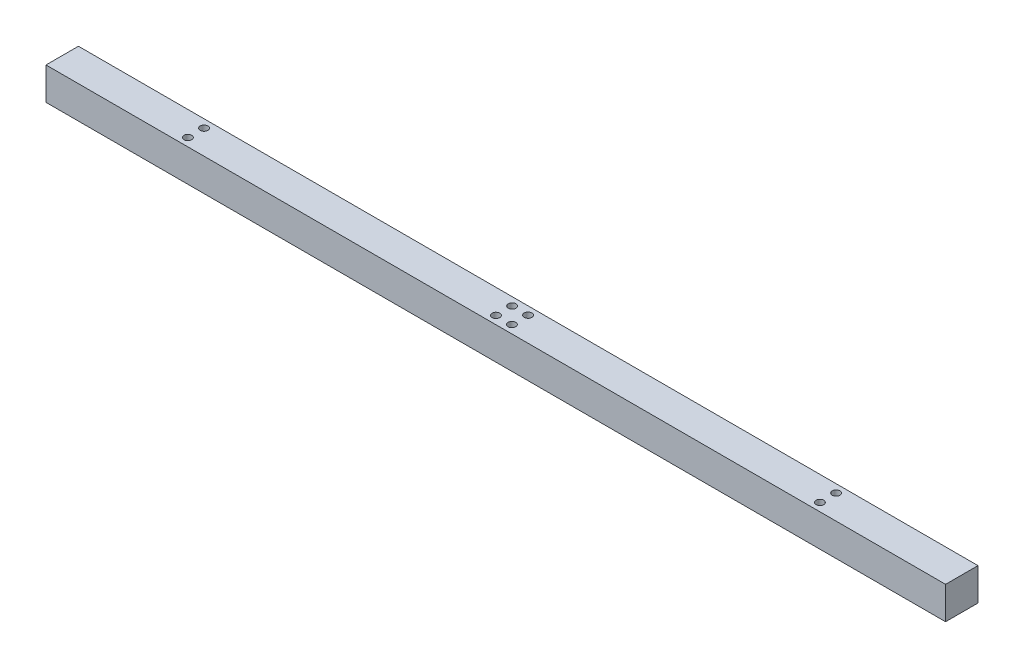
ISO-10303-21;
HEADER;
FILE_DESCRIPTION(('STEP AP214'),'2;1');
FILE_NAME('part.step','',(''),(''),'','','');
FILE_SCHEMA(('AUTOMOTIVE_DESIGN { 1 0 10303 214 1 1 1 1 }'));
ENDSEC;
DATA;
#1=APPLICATION_CONTEXT('core data for automotive mechanical design processes');
#2=APPLICATION_PROTOCOL_DEFINITION('international standard','automotive_design',2000,#1);
#3=PRODUCT_CONTEXT('',#1,'mechanical');
#4=PRODUCT('Part','Part','',(#3));
#5=PRODUCT_RELATED_PRODUCT_CATEGORY('part','',(#4));
#6=PRODUCT_DEFINITION_FORMATION('','',#4);
#7=PRODUCT_DEFINITION_CONTEXT('part definition',#1,'design');
#8=PRODUCT_DEFINITION('design','',#6,#7);
#9=PRODUCT_DEFINITION_SHAPE('','',#8);
#10=(LENGTH_UNIT() NAMED_UNIT(*) SI_UNIT(.MILLI.,.METRE.));
#11=(NAMED_UNIT(*) PLANE_ANGLE_UNIT() SI_UNIT($,.RADIAN.));
#12=(NAMED_UNIT(*) SI_UNIT($,.STERADIAN.) SOLID_ANGLE_UNIT());
#13=UNCERTAINTY_MEASURE_WITH_UNIT(LENGTH_MEASURE(1.E-05),#10,'distance_accuracy_value','');
#14=(GEOMETRIC_REPRESENTATION_CONTEXT(3) GLOBAL_UNCERTAINTY_ASSIGNED_CONTEXT((#13)) GLOBAL_UNIT_ASSIGNED_CONTEXT((#10,
#11,#12)) REPRESENTATION_CONTEXT('',''));
#15=CARTESIAN_POINT('',(0.,0.,0.));
#16=DIRECTION('',(0.,0.,1.));
#17=DIRECTION('',(1.,0.,0.));
#18=AXIS2_PLACEMENT_3D('',#15,#16,#17);
#19=CARTESIAN_POINT('',(277.4,-5.,-5.));
#20=DIRECTION('',(0.,0.,1.));
#21=DIRECTION('',(1.,0.,0.));
#22=AXIS2_PLACEMENT_3D('',#19,#20,#21);
#23=PLANE('',#22);
#24=DIRECTION('',(0.,1.,0.));
#25=VECTOR('',#24,1.);
#26=CARTESIAN_POINT('',(0.,-5.,-5.));
#27=LINE('',#26,#25);
#28=CARTESIAN_POINT('',(0.,-5.,-5.));
#29=VERTEX_POINT('',#28);
#30=CARTESIAN_POINT('',(0.,5.,-5.));
#31=VERTEX_POINT('',#30);
#32=EDGE_CURVE('E179',#29,#31,#27,.T.);
#33=ORIENTED_EDGE('',*,*,#32,.T.);
#34=DIRECTION('',(-1.,0.,0.));
#35=VECTOR('',#34,1.);
#36=CARTESIAN_POINT('',(277.4,5.,-5.));
#37=LINE('',#36,#35);
#38=CARTESIAN_POINT('',(277.4,5.,-5.));
#39=VERTEX_POINT('',#38);
#40=EDGE_CURVE('E11',#39,#31,#37,.T.);
#41=ORIENTED_EDGE('',*,*,#40,.F.);
#42=DIRECTION('',(0.,1.,0.));
#43=VECTOR('',#42,1.);
#44=CARTESIAN_POINT('',(277.4,-5.,-5.));
#45=LINE('',#44,#43);
#46=CARTESIAN_POINT('',(277.4,-5.,-5.));
#47=VERTEX_POINT('',#46);
#48=EDGE_CURVE('E180',#47,#39,#45,.T.);
#49=ORIENTED_EDGE('',*,*,#48,.F.);
#50=DIRECTION('',(-1.,0.,0.));
#51=VECTOR('',#50,1.);
#52=CARTESIAN_POINT('',(277.4,-5.,-5.));
#53=LINE('',#52,#51);
#54=EDGE_CURVE('E186',#47,#29,#53,.T.);
#55=ORIENTED_EDGE('',*,*,#54,.T.);
#56=EDGE_LOOP('',(#33,#41,#49,#55));
#57=FACE_BOUND('',#56,.T.);
#58=ADVANCED_FACE('F32',(#57),#23,.F.);
#59=CARTESIAN_POINT('',(277.4,5.,5.));
#60=DIRECTION('',(0.,-1.,0.));
#61=DIRECTION('',(0.,0.,-1.));
#62=AXIS2_PLACEMENT_3D('',#59,#60,#61);
#63=PLANE('',#62);
#64=CARTESIAN_POINT('',(41.25,5.,-2.50000000000001));
#65=DIRECTION('',(0.,1.,0.));
#66=DIRECTION('',(0.,0.,1.));
#67=AXIS2_PLACEMENT_3D('',#64,#65,#66);
#68=CIRCLE('',#67,1.19062499999999);
#69=CARTESIAN_POINT('',(41.25,5.,-1.30937500000002));
#70=VERTEX_POINT('',#69);
#71=EDGE_CURVE('E121',#70,#70,#68,.T.);
#72=ORIENTED_EDGE('',*,*,#71,.F.);
#73=EDGE_LOOP('',(#72));
#74=FACE_BOUND('',#73,.T.);
#75=CARTESIAN_POINT('',(41.25,5.,2.50000000000005));
#76=DIRECTION('',(0.,1.,0.));
#77=DIRECTION('',(0.,0.,1.));
#78=AXIS2_PLACEMENT_3D('',#75,#76,#77);
#79=CIRCLE('',#78,1.19062499999999);
#80=CARTESIAN_POINT('',(41.25,5.,3.69062500000004));
#81=VERTEX_POINT('',#80);
#82=EDGE_CURVE('E120',#81,#81,#79,.T.);
#83=ORIENTED_EDGE('',*,*,#82,.F.);
#84=EDGE_LOOP('',(#83));
#85=FACE_BOUND('',#84,.T.);
#86=CARTESIAN_POINT('',(136.25,5.,-2.50000000000001));
#87=DIRECTION('',(0.,1.,0.));
#88=DIRECTION('',(0.,0.,1.));
#89=AXIS2_PLACEMENT_3D('',#86,#87,#88);
#90=CIRCLE('',#89,1.190625);
#91=CARTESIAN_POINT('',(136.25,5.,-1.30937500000001));
#92=VERTEX_POINT('',#91);
#93=EDGE_CURVE('E131',#92,#92,#90,.T.);
#94=ORIENTED_EDGE('',*,*,#93,.F.);
#95=EDGE_LOOP('',(#94));
#96=FACE_BOUND('',#95,.T.);
#97=CARTESIAN_POINT('',(136.25,5.,2.50000000000001));
#98=DIRECTION('',(0.,1.,0.));
#99=DIRECTION('',(0.,0.,1.));
#100=AXIS2_PLACEMENT_3D('',#97,#98,#99);
#101=CIRCLE('',#100,1.190625);
#102=CARTESIAN_POINT('',(136.25,5.,3.69062500000001));
#103=VERTEX_POINT('',#102);
#104=EDGE_CURVE('E137',#103,#103,#101,.T.);
#105=ORIENTED_EDGE('',*,*,#104,.F.);
#106=EDGE_LOOP('',(#105));
#107=FACE_BOUND('',#106,.T.);
#108=CARTESIAN_POINT('',(141.15,5.,2.50000000000001));
#109=DIRECTION('',(0.,1.,0.));
#110=DIRECTION('',(0.,0.,1.));
#111=AXIS2_PLACEMENT_3D('',#108,#109,#110);
#112=CIRCLE('',#111,1.190625);
#113=CARTESIAN_POINT('',(141.15,5.,3.69062500000001));
#114=VERTEX_POINT('',#113);
#115=EDGE_CURVE('E143',#114,#114,#112,.T.);
#116=ORIENTED_EDGE('',*,*,#115,.F.);
#117=EDGE_LOOP('',(#116));
#118=FACE_BOUND('',#117,.T.);
#119=CARTESIAN_POINT('',(141.15,5.,-2.50000000000001));
#120=DIRECTION('',(0.,1.,0.));
#121=DIRECTION('',(0.,0.,1.));
#122=AXIS2_PLACEMENT_3D('',#119,#120,#121);
#123=CIRCLE('',#122,1.190625);
#124=CARTESIAN_POINT('',(141.15,5.,-1.30937500000001));
#125=VERTEX_POINT('',#124);
#126=EDGE_CURVE('E149',#125,#125,#123,.T.);
#127=ORIENTED_EDGE('',*,*,#126,.F.);
#128=EDGE_LOOP('',(#127));
#129=FACE_BOUND('',#128,.T.);
#130=CARTESIAN_POINT('',(236.15,5.,2.50000000000003));
#131=DIRECTION('',(0.,1.,0.));
#132=DIRECTION('',(0.,0.,1.));
#133=AXIS2_PLACEMENT_3D('',#130,#131,#132);
#134=CIRCLE('',#133,1.190625);
#135=CARTESIAN_POINT('',(236.15,5.,3.69062500000003));
#136=VERTEX_POINT('',#135);
#137=EDGE_CURVE('E155',#136,#136,#134,.T.);
#138=ORIENTED_EDGE('',*,*,#137,.F.);
#139=EDGE_LOOP('',(#138));
#140=FACE_BOUND('',#139,.T.);
#141=CARTESIAN_POINT('',(236.15,5.,-2.50000000000003));
#142=DIRECTION('',(0.,1.,0.));
#143=DIRECTION('',(0.,0.,1.));
#144=AXIS2_PLACEMENT_3D('',#141,#142,#143);
#145=CIRCLE('',#144,1.190625);
#146=CARTESIAN_POINT('',(236.15,5.,-1.30937500000003));
#147=VERTEX_POINT('',#146);
#148=EDGE_CURVE('E161',#147,#147,#145,.T.);
#149=ORIENTED_EDGE('',*,*,#148,.F.);
#150=EDGE_LOOP('',(#149));
#151=FACE_BOUND('',#150,.T.);
#152=DIRECTION('',(0.,0.,1.));
#153=VECTOR('',#152,1.);
#154=CARTESIAN_POINT('',(0.,5.,5.));
#155=LINE('',#154,#153);
#156=CARTESIAN_POINT('',(0.,5.,5.));
#157=VERTEX_POINT('',#156);
#158=EDGE_CURVE('E189',#31,#157,#155,.T.);
#159=ORIENTED_EDGE('',*,*,#158,.T.);
#160=DIRECTION('',(-1.,0.,0.));
#161=VECTOR('',#160,1.);
#162=CARTESIAN_POINT('',(277.4,5.,5.));
#163=LINE('',#162,#161);
#164=CARTESIAN_POINT('',(277.4,5.,5.));
#165=VERTEX_POINT('',#164);
#166=EDGE_CURVE('E40',#165,#157,#163,.T.);
#167=ORIENTED_EDGE('',*,*,#166,.F.);
#168=DIRECTION('',(0.,0.,1.));
#169=VECTOR('',#168,1.);
#170=CARTESIAN_POINT('',(277.4,5.,5.));
#171=LINE('',#170,#169);
#172=EDGE_CURVE('E79',#39,#165,#171,.T.);
#173=ORIENTED_EDGE('',*,*,#172,.F.);
#174=ORIENTED_EDGE('',*,*,#40,.T.);
#175=EDGE_LOOP('',(#159,#167,#173,#174));
#176=FACE_BOUND('',#175,.T.);
#177=ADVANCED_FACE('F213',(#74,#85,#96,#107,#118,#129,#140,#151,#176),#63,.F.);
#178=CARTESIAN_POINT('',(277.4,-5.,5.));
#179=DIRECTION('',(0.,0.,-1.));
#180=DIRECTION('',(-1.,0.,0.));
#181=AXIS2_PLACEMENT_3D('',#178,#179,#180);
#182=PLANE('',#181);
#183=DIRECTION('',(0.,-1.,0.));
#184=VECTOR('',#183,1.);
#185=CARTESIAN_POINT('',(0.,-5.,5.));
#186=LINE('',#185,#184);
#187=CARTESIAN_POINT('',(0.,-5.,5.));
#188=VERTEX_POINT('',#187);
#189=EDGE_CURVE('E66',#157,#188,#186,.T.);
#190=ORIENTED_EDGE('',*,*,#189,.T.);
#191=DIRECTION('',(-1.,0.,0.));
#192=VECTOR('',#191,1.);
#193=CARTESIAN_POINT('',(277.4,-5.,5.));
#194=LINE('',#193,#192);
#195=CARTESIAN_POINT('',(277.4,-5.,5.));
#196=VERTEX_POINT('',#195);
#197=EDGE_CURVE('E194',#196,#188,#194,.T.);
#198=ORIENTED_EDGE('',*,*,#197,.F.);
#199=DIRECTION('',(0.,-1.,0.));
#200=VECTOR('',#199,1.);
#201=CARTESIAN_POINT('',(277.4,-5.,5.));
#202=LINE('',#201,#200);
#203=EDGE_CURVE('E183',#165,#196,#202,.T.);
#204=ORIENTED_EDGE('',*,*,#203,.F.);
#205=ORIENTED_EDGE('',*,*,#166,.T.);
#206=EDGE_LOOP('',(#190,#198,#204,#205));
#207=FACE_BOUND('',#206,.T.);
#208=ADVANCED_FACE('F196',(#207),#182,.F.);
#209=CARTESIAN_POINT('',(277.4,-5.,5.));
#210=DIRECTION('',(0.,1.,0.));
#211=DIRECTION('',(0.,0.,1.));
#212=AXIS2_PLACEMENT_3D('',#209,#210,#211);
#213=PLANE('',#212);
#214=CARTESIAN_POINT('',(5.85,-5.,0.));
#215=DIRECTION('',(0.,-1.,0.));
#216=DIRECTION('',(0.,0.,-1.));
#217=AXIS2_PLACEMENT_3D('',#214,#215,#216);
#218=CIRCLE('',#217,1.19062499999999);
#219=CARTESIAN_POINT('',(5.85,-5.,-1.19062499999999));
#220=VERTEX_POINT('',#219);
#221=EDGE_CURVE('E167',#220,#220,#218,.T.);
#222=ORIENTED_EDGE('',*,*,#221,.F.);
#223=EDGE_LOOP('',(#222));
#224=FACE_BOUND('',#223,.T.);
#225=CARTESIAN_POINT('',(271.55,-5.,0.));
#226=DIRECTION('',(0.,-1.,0.));
#227=DIRECTION('',(0.,0.,-1.));
#228=AXIS2_PLACEMENT_3D('',#225,#226,#227);
#229=CIRCLE('',#228,1.190625);
#230=CARTESIAN_POINT('',(271.55,-5.,-1.190625));
#231=VERTEX_POINT('',#230);
#232=EDGE_CURVE('E173',#231,#231,#229,.T.);
#233=ORIENTED_EDGE('',*,*,#232,.F.);
#234=EDGE_LOOP('',(#233));
#235=FACE_BOUND('',#234,.T.);
#236=DIRECTION('',(0.,0.,-1.));
#237=VECTOR('',#236,1.);
#238=CARTESIAN_POINT('',(0.,-5.,5.));
#239=LINE('',#238,#237);
#240=EDGE_CURVE('E72',#188,#29,#239,.T.);
#241=ORIENTED_EDGE('',*,*,#240,.T.);
#242=ORIENTED_EDGE('',*,*,#54,.F.);
#243=DIRECTION('',(0.,0.,-1.));
#244=VECTOR('',#243,1.);
#245=CARTESIAN_POINT('',(277.4,-5.,5.));
#246=LINE('',#245,#244);
#247=EDGE_CURVE('E48',#196,#47,#246,.T.);
#248=ORIENTED_EDGE('',*,*,#247,.F.);
#249=ORIENTED_EDGE('',*,*,#197,.T.);
#250=EDGE_LOOP('',(#241,#242,#248,#249));
#251=FACE_BOUND('',#250,.T.);
#252=ADVANCED_FACE('F203',(#224,#235,#251),#213,.F.);
#253=CARTESIAN_POINT('',(277.4,0.,0.));
#254=DIRECTION('',(-1.,0.,0.));
#255=DIRECTION('',(0.,0.,1.));
#256=AXIS2_PLACEMENT_3D('',#253,#254,#255);
#257=PLANE('',#256);
#258=ORIENTED_EDGE('',*,*,#48,.T.);
#259=ORIENTED_EDGE('',*,*,#172,.T.);
#260=ORIENTED_EDGE('',*,*,#203,.T.);
#261=ORIENTED_EDGE('',*,*,#247,.T.);
#262=EDGE_LOOP('',(#258,#259,#260,#261));
#263=FACE_BOUND('',#262,.T.);
#264=ADVANCED_FACE('F205',(#263),#257,.F.);
#265=CARTESIAN_POINT('',(0.,0.,0.));
#266=DIRECTION('',(-1.,0.,0.));
#267=DIRECTION('',(0.,0.,1.));
#268=AXIS2_PLACEMENT_3D('',#265,#266,#267);
#269=PLANE('',#268);
#270=ORIENTED_EDGE('',*,*,#32,.F.);
#271=ORIENTED_EDGE('',*,*,#240,.F.);
#272=ORIENTED_EDGE('',*,*,#189,.F.);
#273=ORIENTED_EDGE('',*,*,#158,.F.);
#274=EDGE_LOOP('',(#270,#271,#272,#273));
#275=FACE_BOUND('',#274,.T.);
#276=ADVANCED_FACE('F199',(#275),#269,.T.);
#277=CARTESIAN_POINT('',(271.55,0.,0.));
#278=DIRECTION('',(0.,-1.,0.));
#279=DIRECTION('',(0.,0.,-1.));
#280=AXIS2_PLACEMENT_3D('',#277,#278,#279);
#281=CONICAL_SURFACE('',#280,1.190625,1.02974425867666);
#282=CARTESIAN_POINT('',(271.55,0.715399674529688,0.));
#283=VERTEX_POINT('',#282);
#284=VERTEX_LOOP('',#283);
#285=FACE_BOUND('',#284,.T.);
#286=CARTESIAN_POINT('',(271.55,0.,0.));
#287=DIRECTION('',(0.,-1.,0.));
#288=DIRECTION('',(0.,0.,-1.));
#289=AXIS2_PLACEMENT_3D('',#286,#287,#288);
#290=CIRCLE('',#289,1.190625);
#291=CARTESIAN_POINT('',(271.55,0.,-1.190625));
#292=VERTEX_POINT('',#291);
#293=EDGE_CURVE('E176',#292,#292,#290,.T.);
#294=ORIENTED_EDGE('',*,*,#293,.T.);
#295=EDGE_LOOP('',(#294));
#296=FACE_BOUND('',#295,.T.);
#297=ADVANCED_FACE('F270',(#285,#296),#281,.F.);
#298=CARTESIAN_POINT('',(271.55,-5.,0.));
#299=DIRECTION('',(0.,-1.,0.));
#300=DIRECTION('',(0.,0.,-1.));
#301=AXIS2_PLACEMENT_3D('',#298,#299,#300);
#302=CYLINDRICAL_SURFACE('',#301,1.190625);
#303=ORIENTED_EDGE('',*,*,#293,.F.);
#304=EDGE_LOOP('',(#303));
#305=FACE_BOUND('',#304,.T.);
#306=ORIENTED_EDGE('',*,*,#232,.T.);
#307=EDGE_LOOP('',(#306));
#308=FACE_BOUND('',#307,.T.);
#309=ADVANCED_FACE('F266',(#305,#308),#302,.F.);
#310=CARTESIAN_POINT('',(5.85,0.,0.));
#311=DIRECTION('',(0.,-1.,0.));
#312=DIRECTION('',(0.,0.,-1.));
#313=AXIS2_PLACEMENT_3D('',#310,#311,#312);
#314=CONICAL_SURFACE('',#313,1.190625,1.02974425867665);
#315=CARTESIAN_POINT('',(5.85,0.715399674529688,0.));
#316=VERTEX_POINT('',#315);
#317=VERTEX_LOOP('',#316);
#318=FACE_BOUND('',#317,.T.);
#319=CARTESIAN_POINT('',(5.85,0.,0.));
#320=DIRECTION('',(0.,-1.,0.));
#321=DIRECTION('',(0.,0.,-1.));
#322=AXIS2_PLACEMENT_3D('',#319,#320,#321);
#323=CIRCLE('',#322,1.190625);
#324=CARTESIAN_POINT('',(5.85,0.,-1.190625));
#325=VERTEX_POINT('',#324);
#326=EDGE_CURVE('E170',#325,#325,#323,.T.);
#327=ORIENTED_EDGE('',*,*,#326,.T.);
#328=EDGE_LOOP('',(#327));
#329=FACE_BOUND('',#328,.T.);
#330=ADVANCED_FACE('F262',(#318,#329),#314,.F.);
#331=CARTESIAN_POINT('',(5.85,-5.,0.));
#332=DIRECTION('',(0.,-1.,0.));
#333=DIRECTION('',(0.,0.,-1.));
#334=AXIS2_PLACEMENT_3D('',#331,#332,#333);
#335=CYLINDRICAL_SURFACE('',#334,1.19062499999999);
#336=ORIENTED_EDGE('',*,*,#326,.F.);
#337=EDGE_LOOP('',(#336));
#338=FACE_BOUND('',#337,.T.);
#339=ORIENTED_EDGE('',*,*,#221,.T.);
#340=EDGE_LOOP('',(#339));
#341=FACE_BOUND('',#340,.T.);
#342=ADVANCED_FACE('F254',(#338,#341),#335,.F.);
#343=CARTESIAN_POINT('',(236.15,0.,-2.50000000000003));
#344=DIRECTION('',(0.,1.,0.));
#345=DIRECTION('',(0.,0.,1.));
#346=AXIS2_PLACEMENT_3D('',#343,#344,#345);
#347=CONICAL_SURFACE('',#346,1.190625,1.02974425867666);
#348=CARTESIAN_POINT('',(236.15,-0.715399674529689,-2.50000000000003));
#349=VERTEX_POINT('',#348);
#350=VERTEX_LOOP('',#349);
#351=FACE_BOUND('',#350,.T.);
#352=CARTESIAN_POINT('',(236.15,0.,-2.50000000000003));
#353=DIRECTION('',(0.,1.,0.));
#354=DIRECTION('',(0.,0.,1.));
#355=AXIS2_PLACEMENT_3D('',#352,#353,#354);
#356=CIRCLE('',#355,1.190625);
#357=CARTESIAN_POINT('',(236.15,0.,-1.30937500000003));
#358=VERTEX_POINT('',#357);
#359=EDGE_CURVE('E164',#358,#358,#356,.T.);
#360=ORIENTED_EDGE('',*,*,#359,.T.);
#361=EDGE_LOOP('',(#360));
#362=FACE_BOUND('',#361,.T.);
#363=ADVANCED_FACE('F244',(#351,#362),#347,.F.);
#364=CARTESIAN_POINT('',(236.15,5.,-2.50000000000003));
#365=DIRECTION('',(0.,1.,0.));
#366=DIRECTION('',(0.,0.,1.));
#367=AXIS2_PLACEMENT_3D('',#364,#365,#366);
#368=CYLINDRICAL_SURFACE('',#367,1.190625);
#369=ORIENTED_EDGE('',*,*,#359,.F.);
#370=EDGE_LOOP('',(#369));
#371=FACE_BOUND('',#370,.T.);
#372=ORIENTED_EDGE('',*,*,#148,.T.);
#373=EDGE_LOOP('',(#372));
#374=FACE_BOUND('',#373,.T.);
#375=ADVANCED_FACE('F241',(#371,#374),#368,.F.);
#376=CARTESIAN_POINT('',(236.15,0.,2.50000000000003));
#377=DIRECTION('',(0.,1.,0.));
#378=DIRECTION('',(0.,0.,1.));
#379=AXIS2_PLACEMENT_3D('',#376,#377,#378);
#380=CONICAL_SURFACE('',#379,1.190625,1.02974425867666);
#381=CARTESIAN_POINT('',(236.15,-0.715399674529689,2.50000000000003));
#382=VERTEX_POINT('',#381);
#383=VERTEX_LOOP('',#382);
#384=FACE_BOUND('',#383,.T.);
#385=CARTESIAN_POINT('',(236.15,0.,2.50000000000003));
#386=DIRECTION('',(0.,1.,0.));
#387=DIRECTION('',(0.,0.,1.));
#388=AXIS2_PLACEMENT_3D('',#385,#386,#387);
#389=CIRCLE('',#388,1.190625);
#390=CARTESIAN_POINT('',(236.15,0.,3.69062500000003));
#391=VERTEX_POINT('',#390);
#392=EDGE_CURVE('E158',#391,#391,#389,.T.);
#393=ORIENTED_EDGE('',*,*,#392,.T.);
#394=EDGE_LOOP('',(#393));
#395=FACE_BOUND('',#394,.T.);
#396=ADVANCED_FACE('F243',(#384,#395),#380,.F.);
#397=CARTESIAN_POINT('',(236.15,5.,2.50000000000003));
#398=DIRECTION('',(0.,1.,0.));
#399=DIRECTION('',(0.,0.,1.));
#400=AXIS2_PLACEMENT_3D('',#397,#398,#399);
#401=CYLINDRICAL_SURFACE('',#400,1.190625);
#402=ORIENTED_EDGE('',*,*,#392,.F.);
#403=EDGE_LOOP('',(#402));
#404=FACE_BOUND('',#403,.T.);
#405=ORIENTED_EDGE('',*,*,#137,.T.);
#406=EDGE_LOOP('',(#405));
#407=FACE_BOUND('',#406,.T.);
#408=ADVANCED_FACE('F251',(#404,#407),#401,.F.);
#409=CARTESIAN_POINT('',(141.15,0.,-2.50000000000001));
#410=DIRECTION('',(0.,1.,0.));
#411=DIRECTION('',(0.,0.,1.));
#412=AXIS2_PLACEMENT_3D('',#409,#410,#411);
#413=CONICAL_SURFACE('',#412,1.19062499999997,1.02974425867665);
#414=CARTESIAN_POINT('',(141.15,-0.715399674529689,-2.50000000000001));
#415=VERTEX_POINT('',#414);
#416=VERTEX_LOOP('',#415);
#417=FACE_BOUND('',#416,.T.);
#418=CARTESIAN_POINT('',(141.15,0.,-2.50000000000001));
#419=DIRECTION('',(0.,1.,0.));
#420=DIRECTION('',(0.,0.,1.));
#421=AXIS2_PLACEMENT_3D('',#418,#419,#420);
#422=CIRCLE('',#421,1.19062499999997);
#423=CARTESIAN_POINT('',(141.15,0.,-1.30937500000003));
#424=VERTEX_POINT('',#423);
#425=EDGE_CURVE('E152',#424,#424,#422,.T.);
#426=ORIENTED_EDGE('',*,*,#425,.T.);
#427=EDGE_LOOP('',(#426));
#428=FACE_BOUND('',#427,.T.);
#429=ADVANCED_FACE('F320',(#417,#428),#413,.F.);
#430=CARTESIAN_POINT('',(141.15,5.,-2.50000000000001));
#431=DIRECTION('',(0.,1.,0.));
#432=DIRECTION('',(0.,0.,1.));
#433=AXIS2_PLACEMENT_3D('',#430,#431,#432);
#434=CYLINDRICAL_SURFACE('',#433,1.19062499999999);
#435=ORIENTED_EDGE('',*,*,#425,.F.);
#436=EDGE_LOOP('',(#435));
#437=FACE_BOUND('',#436,.T.);
#438=ORIENTED_EDGE('',*,*,#126,.T.);
#439=EDGE_LOOP('',(#438));
#440=FACE_BOUND('',#439,.T.);
#441=ADVANCED_FACE('F329',(#437,#440),#434,.F.);
#442=CARTESIAN_POINT('',(141.15,0.,2.50000000000001));
#443=DIRECTION('',(0.,1.,0.));
#444=DIRECTION('',(0.,0.,1.));
#445=AXIS2_PLACEMENT_3D('',#442,#443,#444);
#446=CONICAL_SURFACE('',#445,1.19062499999997,1.02974425867665);
#447=CARTESIAN_POINT('',(141.15,-0.715399674529689,2.50000000000001));
#448=VERTEX_POINT('',#447);
#449=VERTEX_LOOP('',#448);
#450=FACE_BOUND('',#449,.T.);
#451=CARTESIAN_POINT('',(141.15,0.,2.50000000000001));
#452=DIRECTION('',(0.,1.,0.));
#453=DIRECTION('',(0.,0.,1.));
#454=AXIS2_PLACEMENT_3D('',#451,#452,#453);
#455=CIRCLE('',#454,1.19062499999997);
#456=CARTESIAN_POINT('',(141.15,0.,3.69062499999998));
#457=VERTEX_POINT('',#456);
#458=EDGE_CURVE('E146',#457,#457,#455,.T.);
#459=ORIENTED_EDGE('',*,*,#458,.T.);
#460=EDGE_LOOP('',(#459));
#461=FACE_BOUND('',#460,.T.);
#462=ADVANCED_FACE('F339',(#450,#461),#446,.F.);
#463=CARTESIAN_POINT('',(141.15,5.,2.50000000000001));
#464=DIRECTION('',(0.,1.,0.));
#465=DIRECTION('',(0.,0.,1.));
#466=AXIS2_PLACEMENT_3D('',#463,#464,#465);
#467=CYLINDRICAL_SURFACE('',#466,1.19062499999999);
#468=ORIENTED_EDGE('',*,*,#458,.F.);
#469=EDGE_LOOP('',(#468));
#470=FACE_BOUND('',#469,.T.);
#471=ORIENTED_EDGE('',*,*,#115,.T.);
#472=EDGE_LOOP('',(#471));
#473=FACE_BOUND('',#472,.T.);
#474=ADVANCED_FACE('F349',(#470,#473),#467,.F.);
#475=CARTESIAN_POINT('',(136.25,0.,2.50000000000001));
#476=DIRECTION('',(0.,1.,0.));
#477=DIRECTION('',(0.,0.,1.));
#478=AXIS2_PLACEMENT_3D('',#475,#476,#477);
#479=CONICAL_SURFACE('',#478,1.19062499999997,1.02974425867665);
#480=CARTESIAN_POINT('',(136.25,-0.715399674529689,2.50000000000001));
#481=VERTEX_POINT('',#480);
#482=VERTEX_LOOP('',#481);
#483=FACE_BOUND('',#482,.T.);
#484=CARTESIAN_POINT('',(136.25,0.,2.50000000000001));
#485=DIRECTION('',(0.,1.,0.));
#486=DIRECTION('',(0.,0.,1.));
#487=AXIS2_PLACEMENT_3D('',#484,#485,#486);
#488=CIRCLE('',#487,1.19062499999997);
#489=CARTESIAN_POINT('',(136.25,0.,3.69062499999998));
#490=VERTEX_POINT('',#489);
#491=EDGE_CURVE('E140',#490,#490,#488,.T.);
#492=ORIENTED_EDGE('',*,*,#491,.T.);
#493=EDGE_LOOP('',(#492));
#494=FACE_BOUND('',#493,.T.);
#495=ADVANCED_FACE('F359',(#483,#494),#479,.F.);
#496=CARTESIAN_POINT('',(136.25,5.,2.50000000000001));
#497=DIRECTION('',(0.,1.,0.));
#498=DIRECTION('',(0.,0.,1.));
#499=AXIS2_PLACEMENT_3D('',#496,#497,#498);
#500=CYLINDRICAL_SURFACE('',#499,1.19062499999999);
#501=ORIENTED_EDGE('',*,*,#491,.F.);
#502=EDGE_LOOP('',(#501));
#503=FACE_BOUND('',#502,.T.);
#504=ORIENTED_EDGE('',*,*,#104,.T.);
#505=EDGE_LOOP('',(#504));
#506=FACE_BOUND('',#505,.T.);
#507=ADVANCED_FACE('F369',(#503,#506),#500,.F.);
#508=CARTESIAN_POINT('',(136.25,0.,-2.50000000000001));
#509=DIRECTION('',(0.,1.,0.));
#510=DIRECTION('',(0.,0.,1.));
#511=AXIS2_PLACEMENT_3D('',#508,#509,#510);
#512=CONICAL_SURFACE('',#511,1.19062499999997,1.02974425867665);
#513=CARTESIAN_POINT('',(136.25,-0.715399674529689,-2.50000000000001));
#514=VERTEX_POINT('',#513);
#515=VERTEX_LOOP('',#514);
#516=FACE_BOUND('',#515,.T.);
#517=CARTESIAN_POINT('',(136.25,0.,-2.50000000000001));
#518=DIRECTION('',(0.,1.,0.));
#519=DIRECTION('',(0.,0.,1.));
#520=AXIS2_PLACEMENT_3D('',#517,#518,#519);
#521=CIRCLE('',#520,1.19062499999997);
#522=CARTESIAN_POINT('',(136.25,0.,-1.30937500000003));
#523=VERTEX_POINT('',#522);
#524=EDGE_CURVE('E134',#523,#523,#521,.T.);
#525=ORIENTED_EDGE('',*,*,#524,.T.);
#526=EDGE_LOOP('',(#525));
#527=FACE_BOUND('',#526,.T.);
#528=ADVANCED_FACE('F379',(#516,#527),#512,.F.);
#529=CARTESIAN_POINT('',(136.25,5.,-2.50000000000001));
#530=DIRECTION('',(0.,1.,0.));
#531=DIRECTION('',(0.,0.,1.));
#532=AXIS2_PLACEMENT_3D('',#529,#530,#531);
#533=CYLINDRICAL_SURFACE('',#532,1.19062499999999);
#534=ORIENTED_EDGE('',*,*,#524,.F.);
#535=EDGE_LOOP('',(#534));
#536=FACE_BOUND('',#535,.T.);
#537=ORIENTED_EDGE('',*,*,#93,.T.);
#538=EDGE_LOOP('',(#537));
#539=FACE_BOUND('',#538,.T.);
#540=ADVANCED_FACE('F389',(#536,#539),#533,.F.);
#541=CARTESIAN_POINT('',(41.25,0.,2.50000000000005));
#542=DIRECTION('',(0.,1.,0.));
#543=DIRECTION('',(0.,0.,1.));
#544=AXIS2_PLACEMENT_3D('',#541,#542,#543);
#545=CONICAL_SURFACE('',#544,1.19062499999999,1.02974425867665);
#546=CARTESIAN_POINT('',(41.25,-0.715399674529689,2.50000000000005));
#547=VERTEX_POINT('',#546);
#548=VERTEX_LOOP('',#547);
#549=FACE_BOUND('',#548,.T.);
#550=CARTESIAN_POINT('',(41.25,0.,2.50000000000005));
#551=DIRECTION('',(0.,1.,0.));
#552=DIRECTION('',(0.,0.,1.));
#553=AXIS2_PLACEMENT_3D('',#550,#551,#552);
#554=CIRCLE('',#553,1.19062499999999);
#555=CARTESIAN_POINT('',(41.25,0.,3.69062500000004));
#556=VERTEX_POINT('',#555);
#557=EDGE_CURVE('E124',#556,#556,#554,.T.);
#558=ORIENTED_EDGE('',*,*,#557,.T.);
#559=EDGE_LOOP('',(#558));
#560=FACE_BOUND('',#559,.T.);
#561=ADVANCED_FACE('F399',(#549,#560),#545,.F.);
#562=CARTESIAN_POINT('',(41.25,5.,2.50000000000005));
#563=DIRECTION('',(0.,1.,0.));
#564=DIRECTION('',(0.,0.,1.));
#565=AXIS2_PLACEMENT_3D('',#562,#563,#564);
#566=CYLINDRICAL_SURFACE('',#565,1.19062499999999);
#567=ORIENTED_EDGE('',*,*,#557,.F.);
#568=EDGE_LOOP('',(#567));
#569=FACE_BOUND('',#568,.T.);
#570=ORIENTED_EDGE('',*,*,#82,.T.);
#571=EDGE_LOOP('',(#570));
#572=FACE_BOUND('',#571,.T.);
#573=ADVANCED_FACE('F114',(#569,#572),#566,.F.);
#574=CARTESIAN_POINT('',(41.25,0.,-2.50000000000001));
#575=DIRECTION('',(0.,1.,0.));
#576=DIRECTION('',(0.,0.,1.));
#577=AXIS2_PLACEMENT_3D('',#574,#575,#576);
#578=CONICAL_SURFACE('',#577,1.19062499999999,1.02974425867665);
#579=CARTESIAN_POINT('',(41.25,-0.715399674529689,-2.50000000000001));
#580=VERTEX_POINT('',#579);
#581=VERTEX_LOOP('',#580);
#582=FACE_BOUND('',#581,.T.);
#583=CARTESIAN_POINT('',(41.25,0.,-2.50000000000001));
#584=DIRECTION('',(0.,1.,0.));
#585=DIRECTION('',(0.,0.,1.));
#586=AXIS2_PLACEMENT_3D('',#583,#584,#585);
#587=CIRCLE('',#586,1.19062499999999);
#588=CARTESIAN_POINT('',(41.25,0.,-1.30937500000002));
#589=VERTEX_POINT('',#588);
#590=EDGE_CURVE('E118',#589,#589,#587,.T.);
#591=ORIENTED_EDGE('',*,*,#590,.T.);
#592=EDGE_LOOP('',(#591));
#593=FACE_BOUND('',#592,.T.);
#594=ADVANCED_FACE('F110',(#582,#593),#578,.F.);
#595=CARTESIAN_POINT('',(41.25,5.,-2.50000000000001));
#596=DIRECTION('',(0.,1.,0.));
#597=DIRECTION('',(0.,0.,1.));
#598=AXIS2_PLACEMENT_3D('',#595,#596,#597);
#599=CYLINDRICAL_SURFACE('',#598,1.19062499999999);
#600=ORIENTED_EDGE('',*,*,#590,.F.);
#601=EDGE_LOOP('',(#600));
#602=FACE_BOUND('',#601,.T.);
#603=ORIENTED_EDGE('',*,*,#71,.T.);
#604=EDGE_LOOP('',(#603));
#605=FACE_BOUND('',#604,.T.);
#606=ADVANCED_FACE('F113',(#602,#605),#599,.F.);
#607=CLOSED_SHELL('',(#58,#177,#208,#252,#264,#276,#297,#309,#330,#342,#363,#375,#396,#408,#429,
#441,#462,#474,#495,#507,#528,#540,#561,#573,#594,#606));
#608=MANIFOLD_SOLID_BREP('B2',#607);
#609=ADVANCED_BREP_SHAPE_REPRESENTATION('',(#18,#608),#14);
#610=SHAPE_DEFINITION_REPRESENTATION(#9,#609);
ENDSEC;
END-ISO-10303-21;
